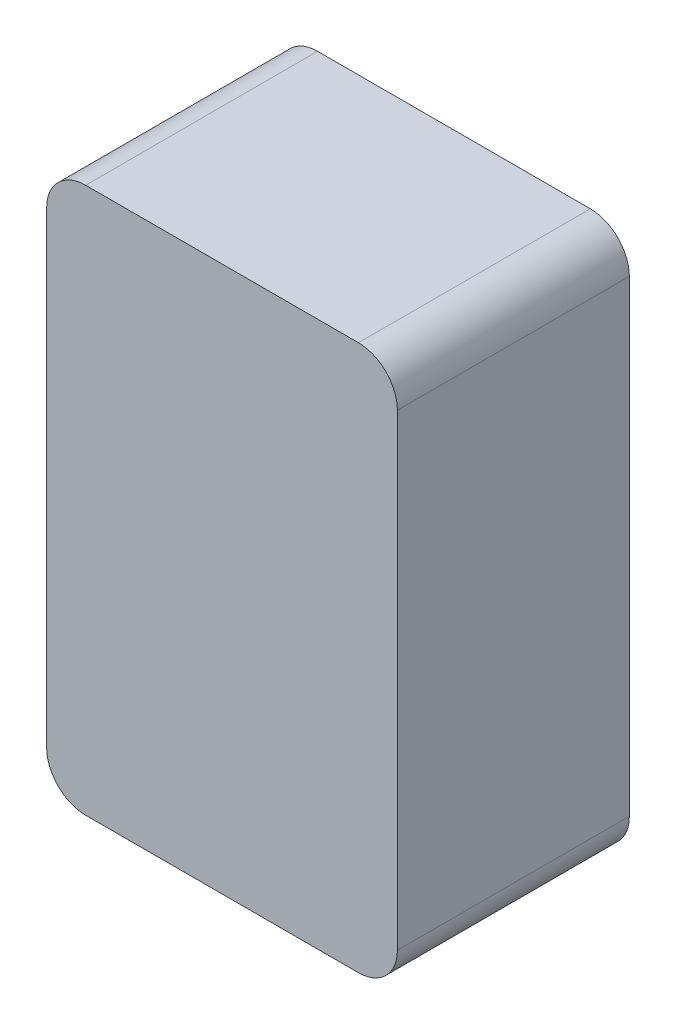
ISO-10303-21;
HEADER;
FILE_DESCRIPTION(('STEP AP214'),'2;1');
FILE_NAME('part.step','',(''),(''),'','','');
FILE_SCHEMA(('AUTOMOTIVE_DESIGN { 1 0 10303 214 1 1 1 1 }'));
ENDSEC;
DATA;
#1=APPLICATION_CONTEXT('core data for automotive mechanical design processes');
#2=APPLICATION_PROTOCOL_DEFINITION('international standard','automotive_design',2000,#1);
#3=PRODUCT_CONTEXT('',#1,'mechanical');
#4=PRODUCT('Part','Part','',(#3));
#5=PRODUCT_RELATED_PRODUCT_CATEGORY('part','',(#4));
#6=PRODUCT_DEFINITION_FORMATION('','',#4);
#7=PRODUCT_DEFINITION_CONTEXT('part definition',#1,'design');
#8=PRODUCT_DEFINITION('design','',#6,#7);
#9=PRODUCT_DEFINITION_SHAPE('','',#8);
#10=(LENGTH_UNIT() NAMED_UNIT(*) SI_UNIT(.MILLI.,.METRE.));
#11=(NAMED_UNIT(*) PLANE_ANGLE_UNIT() SI_UNIT($,.RADIAN.));
#12=(NAMED_UNIT(*) SI_UNIT($,.STERADIAN.) SOLID_ANGLE_UNIT());
#13=UNCERTAINTY_MEASURE_WITH_UNIT(LENGTH_MEASURE(1.E-05),#10,'distance_accuracy_value','');
#14=(GEOMETRIC_REPRESENTATION_CONTEXT(3) GLOBAL_UNCERTAINTY_ASSIGNED_CONTEXT((#13)) GLOBAL_UNIT_ASSIGNED_CONTEXT((#10,
#11,#12)) REPRESENTATION_CONTEXT('',''));
#15=CARTESIAN_POINT('',(0.,0.,0.));
#16=DIRECTION('',(0.,0.,1.));
#17=DIRECTION('',(1.,0.,0.));
#18=AXIS2_PLACEMENT_3D('',#15,#16,#17);
#19=CARTESIAN_POINT('',(14.2875,22.225,18.8976));
#20=DIRECTION('',(-1.,0.,0.));
#21=DIRECTION('',(0.,-1.,0.));
#22=AXIS2_PLACEMENT_3D('',#19,#20,#21);
#23=PLANE('',#22);
#24=DIRECTION('',(0.,1.,0.));
#25=VECTOR('',#24,1.);
#26=CARTESIAN_POINT('',(14.2875,22.225,18.8976));
#27=LINE('',#26,#25);
#28=CARTESIAN_POINT('',(14.2875,-19.05,18.8976));
#29=VERTEX_POINT('',#28);
#30=CARTESIAN_POINT('',(14.2875,19.05,18.8976));
#31=VERTEX_POINT('',#30);
#32=EDGE_CURVE('E138',#29,#31,#27,.T.);
#33=ORIENTED_EDGE('',*,*,#32,.F.);
#34=DIRECTION('',(0.,0.,-1.));
#35=VECTOR('',#34,1.);
#36=CARTESIAN_POINT('',(14.2875,-19.05,18.8976));
#37=LINE('',#36,#35);
#38=CARTESIAN_POINT('',(14.2875,-19.05,0.));
#39=VERTEX_POINT('',#38);
#40=EDGE_CURVE('E177',#29,#39,#37,.T.);
#41=ORIENTED_EDGE('',*,*,#40,.T.);
#42=DIRECTION('',(0.,1.,0.));
#43=VECTOR('',#42,1.);
#44=CARTESIAN_POINT('',(14.2875,22.225,0.));
#45=LINE('',#44,#43);
#46=CARTESIAN_POINT('',(14.2875,19.05,0.));
#47=VERTEX_POINT('',#46);
#48=EDGE_CURVE('E188',#39,#47,#45,.T.);
#49=ORIENTED_EDGE('',*,*,#48,.T.);
#50=DIRECTION('',(0.,0.,-1.));
#51=VECTOR('',#50,1.);
#52=CARTESIAN_POINT('',(14.2875,19.05,18.8976));
#53=LINE('',#52,#51);
#54=EDGE_CURVE('E174',#47,#31,#53,.F.);
#55=ORIENTED_EDGE('',*,*,#54,.T.);
#56=EDGE_LOOP('',(#33,#41,#49,#55));
#57=FACE_BOUND('',#56,.T.);
#58=ADVANCED_FACE('F43',(#57),#23,.F.);
#59=CARTESIAN_POINT('',(-14.2875,22.225,18.8976));
#60=DIRECTION('',(0.,-1.,0.));
#61=DIRECTION('',(0.,0.,-1.));
#62=AXIS2_PLACEMENT_3D('',#59,#60,#61);
#63=PLANE('',#62);
#64=DIRECTION('',(-1.,0.,0.));
#65=VECTOR('',#64,1.);
#66=CARTESIAN_POINT('',(-14.2875,22.225,0.));
#67=LINE('',#66,#65);
#68=CARTESIAN_POINT('',(11.1125,22.225,0.));
#69=VERTEX_POINT('',#68);
#70=CARTESIAN_POINT('',(-11.1125,22.225,0.));
#71=VERTEX_POINT('',#70);
#72=EDGE_CURVE('E145',#69,#71,#67,.T.);
#73=ORIENTED_EDGE('',*,*,#72,.T.);
#74=DIRECTION('',(0.,0.,-1.));
#75=VECTOR('',#74,1.);
#76=CARTESIAN_POINT('',(-11.1125,22.225,18.8976));
#77=LINE('',#76,#75);
#78=CARTESIAN_POINT('',(-11.1125,22.225,18.8976));
#79=VERTEX_POINT('',#78);
#80=EDGE_CURVE('E11',#71,#79,#77,.F.);
#81=ORIENTED_EDGE('',*,*,#80,.T.);
#82=DIRECTION('',(-1.,0.,0.));
#83=VECTOR('',#82,1.);
#84=CARTESIAN_POINT('',(-14.2875,22.225,18.8976));
#85=LINE('',#84,#83);
#86=CARTESIAN_POINT('',(11.1125,22.225,18.8976));
#87=VERTEX_POINT('',#86);
#88=EDGE_CURVE('E143',#87,#79,#85,.T.);
#89=ORIENTED_EDGE('',*,*,#88,.F.);
#90=DIRECTION('',(0.,0.,-1.));
#91=VECTOR('',#90,1.);
#92=CARTESIAN_POINT('',(11.1125,22.225,18.8976));
#93=LINE('',#92,#91);
#94=EDGE_CURVE('E52',#87,#69,#93,.T.);
#95=ORIENTED_EDGE('',*,*,#94,.T.);
#96=EDGE_LOOP('',(#73,#81,#89,#95));
#97=FACE_BOUND('',#96,.T.);
#98=ADVANCED_FACE('F184',(#97),#63,.F.);
#99=CARTESIAN_POINT('',(-14.2875,22.225,18.8976));
#100=DIRECTION('',(1.,0.,0.));
#101=DIRECTION('',(0.,1.,0.));
#102=AXIS2_PLACEMENT_3D('',#99,#100,#101);
#103=PLANE('',#102);
#104=DIRECTION('',(0.,-1.,0.));
#105=VECTOR('',#104,1.);
#106=CARTESIAN_POINT('',(-14.2875,22.225,0.));
#107=LINE('',#106,#105);
#108=CARTESIAN_POINT('',(-14.2875,19.05,0.));
#109=VERTEX_POINT('',#108);
#110=CARTESIAN_POINT('',(-14.2875,-19.05,0.));
#111=VERTEX_POINT('',#110);
#112=EDGE_CURVE('E139',#109,#111,#107,.T.);
#113=ORIENTED_EDGE('',*,*,#112,.T.);
#114=DIRECTION('',(0.,0.,-1.));
#115=VECTOR('',#114,1.);
#116=CARTESIAN_POINT('',(-14.2875,-19.05,18.8976));
#117=LINE('',#116,#115);
#118=CARTESIAN_POINT('',(-14.2875,-19.05,18.8976));
#119=VERTEX_POINT('',#118);
#120=EDGE_CURVE('E114',#111,#119,#117,.F.);
#121=ORIENTED_EDGE('',*,*,#120,.T.);
#122=DIRECTION('',(0.,-1.,0.));
#123=VECTOR('',#122,1.);
#124=CARTESIAN_POINT('',(-14.2875,22.225,18.8976));
#125=LINE('',#124,#123);
#126=CARTESIAN_POINT('',(-14.2875,19.05,18.8976));
#127=VERTEX_POINT('',#126);
#128=EDGE_CURVE('E194',#127,#119,#125,.T.);
#129=ORIENTED_EDGE('',*,*,#128,.F.);
#130=DIRECTION('',(0.,0.,-1.));
#131=VECTOR('',#130,1.);
#132=CARTESIAN_POINT('',(-14.2875,19.05,18.8976));
#133=LINE('',#132,#131);
#134=EDGE_CURVE('E120',#127,#109,#133,.T.);
#135=ORIENTED_EDGE('',*,*,#134,.T.);
#136=EDGE_LOOP('',(#113,#121,#129,#135));
#137=FACE_BOUND('',#136,.T.);
#138=ADVANCED_FACE('F206',(#137),#103,.F.);
#139=CARTESIAN_POINT('',(-14.2875,-22.225,18.8976));
#140=DIRECTION('',(0.,1.,0.));
#141=DIRECTION('',(0.,0.,1.));
#142=AXIS2_PLACEMENT_3D('',#139,#140,#141);
#143=PLANE('',#142);
#144=DIRECTION('',(1.,0.,0.));
#145=VECTOR('',#144,1.);
#146=CARTESIAN_POINT('',(-14.2875,-22.225,18.8976));
#147=LINE('',#146,#145);
#148=CARTESIAN_POINT('',(-11.1125,-22.225,18.8976));
#149=VERTEX_POINT('',#148);
#150=CARTESIAN_POINT('',(11.1125,-22.225,18.8976));
#151=VERTEX_POINT('',#150);
#152=EDGE_CURVE('E130',#149,#151,#147,.T.);
#153=ORIENTED_EDGE('',*,*,#152,.F.);
#154=DIRECTION('',(0.,0.,-1.));
#155=VECTOR('',#154,1.);
#156=CARTESIAN_POINT('',(-11.1125,-22.225,18.8976));
#157=LINE('',#156,#155);
#158=CARTESIAN_POINT('',(-11.1125,-22.225,0.));
#159=VERTEX_POINT('',#158);
#160=EDGE_CURVE('E113',#149,#159,#157,.T.);
#161=ORIENTED_EDGE('',*,*,#160,.T.);
#162=DIRECTION('',(1.,0.,0.));
#163=VECTOR('',#162,1.);
#164=CARTESIAN_POINT('',(-14.2875,-22.225,0.));
#165=LINE('',#164,#163);
#166=CARTESIAN_POINT('',(11.1125,-22.225,0.));
#167=VERTEX_POINT('',#166);
#168=EDGE_CURVE('E127',#159,#167,#165,.T.);
#169=ORIENTED_EDGE('',*,*,#168,.T.);
#170=DIRECTION('',(0.,0.,-1.));
#171=VECTOR('',#170,1.);
#172=CARTESIAN_POINT('',(11.1125,-22.225,18.8976));
#173=LINE('',#172,#171);
#174=EDGE_CURVE('E133',#167,#151,#173,.F.);
#175=ORIENTED_EDGE('',*,*,#174,.T.);
#176=EDGE_LOOP('',(#153,#161,#169,#175));
#177=FACE_BOUND('',#176,.T.);
#178=ADVANCED_FACE('F126',(#177),#143,.F.);
#179=CARTESIAN_POINT('',(0.,0.,18.8976));
#180=DIRECTION('',(0.,0.,1.));
#181=DIRECTION('',(1.,0.,0.));
#182=AXIS2_PLACEMENT_3D('',#179,#180,#181);
#183=PLANE('',#182);
#184=ORIENTED_EDGE('',*,*,#128,.T.);
#185=CARTESIAN_POINT('',(-11.1125,-19.05,18.8976));
#186=DIRECTION('',(0.,0.,1.));
#187=DIRECTION('',(1.,0.,0.));
#188=AXIS2_PLACEMENT_3D('',#185,#186,#187);
#189=CIRCLE('',#188,3.175);
#190=EDGE_CURVE('E171',#119,#149,#189,.T.);
#191=ORIENTED_EDGE('',*,*,#190,.T.);
#192=ORIENTED_EDGE('',*,*,#152,.T.);
#193=CARTESIAN_POINT('',(11.1125,-19.05,18.8976));
#194=DIRECTION('',(0.,0.,1.));
#195=DIRECTION('',(1.,0.,0.));
#196=AXIS2_PLACEMENT_3D('',#193,#194,#195);
#197=CIRCLE('',#196,3.175);
#198=EDGE_CURVE('E168',#151,#29,#197,.T.);
#199=ORIENTED_EDGE('',*,*,#198,.T.);
#200=ORIENTED_EDGE('',*,*,#32,.T.);
#201=CARTESIAN_POINT('',(11.1125,19.05,18.8976));
#202=DIRECTION('',(0.,0.,1.));
#203=DIRECTION('',(1.,0.,0.));
#204=AXIS2_PLACEMENT_3D('',#201,#202,#203);
#205=CIRCLE('',#204,3.175);
#206=EDGE_CURVE('E64',#31,#87,#205,.T.);
#207=ORIENTED_EDGE('',*,*,#206,.T.);
#208=ORIENTED_EDGE('',*,*,#88,.T.);
#209=CARTESIAN_POINT('',(-11.1125,19.05,18.8976));
#210=DIRECTION('',(0.,0.,1.));
#211=DIRECTION('',(1.,0.,0.));
#212=AXIS2_PLACEMENT_3D('',#209,#210,#211);
#213=CIRCLE('',#212,3.175);
#214=EDGE_CURVE('E165',#79,#127,#213,.T.);
#215=ORIENTED_EDGE('',*,*,#214,.T.);
#216=EDGE_LOOP('',(#184,#191,#192,#199,#200,#207,#208,#215));
#217=FACE_BOUND('',#216,.T.);
#218=ADVANCED_FACE('F200',(#217),#183,.T.);
#219=CARTESIAN_POINT('',(0.,0.,0.));
#220=DIRECTION('',(0.,0.,1.));
#221=DIRECTION('',(1.,0.,0.));
#222=AXIS2_PLACEMENT_3D('',#219,#220,#221);
#223=PLANE('',#222);
#224=ORIENTED_EDGE('',*,*,#168,.F.);
#225=CARTESIAN_POINT('',(-11.1125,-19.05,0.));
#226=DIRECTION('',(0.,0.,1.));
#227=DIRECTION('',(1.,0.,0.));
#228=AXIS2_PLACEMENT_3D('',#225,#226,#227);
#229=CIRCLE('',#228,3.175);
#230=EDGE_CURVE('E109',#159,#111,#229,.F.);
#231=ORIENTED_EDGE('',*,*,#230,.T.);
#232=ORIENTED_EDGE('',*,*,#112,.F.);
#233=CARTESIAN_POINT('',(-11.1125,19.05,0.));
#234=DIRECTION('',(0.,0.,1.));
#235=DIRECTION('',(1.,0.,0.));
#236=AXIS2_PLACEMENT_3D('',#233,#234,#235);
#237=CIRCLE('',#236,3.175);
#238=EDGE_CURVE('E153',#109,#71,#237,.F.);
#239=ORIENTED_EDGE('',*,*,#238,.T.);
#240=ORIENTED_EDGE('',*,*,#72,.F.);
#241=CARTESIAN_POINT('',(11.1125,19.05,0.));
#242=DIRECTION('',(0.,0.,1.));
#243=DIRECTION('',(1.,0.,0.));
#244=AXIS2_PLACEMENT_3D('',#241,#242,#243);
#245=CIRCLE('',#244,3.175);
#246=EDGE_CURVE('E132',#69,#47,#245,.F.);
#247=ORIENTED_EDGE('',*,*,#246,.T.);
#248=ORIENTED_EDGE('',*,*,#48,.F.);
#249=CARTESIAN_POINT('',(11.1125,-19.05,0.));
#250=DIRECTION('',(0.,0.,1.));
#251=DIRECTION('',(1.,0.,0.));
#252=AXIS2_PLACEMENT_3D('',#249,#250,#251);
#253=CIRCLE('',#252,3.175);
#254=EDGE_CURVE('E121',#39,#167,#253,.F.);
#255=ORIENTED_EDGE('',*,*,#254,.T.);
#256=EDGE_LOOP('',(#224,#231,#232,#239,#240,#247,#248,#255));
#257=FACE_BOUND('',#256,.T.);
#258=ADVANCED_FACE('F135',(#257),#223,.F.);
#259=CARTESIAN_POINT('',(-11.1125,-19.05,18.8976));
#260=DIRECTION('',(0.,0.,-1.));
#261=DIRECTION('',(-1.,0.,0.));
#262=AXIS2_PLACEMENT_3D('',#259,#260,#261);
#263=CYLINDRICAL_SURFACE('',#262,3.175);
#264=ORIENTED_EDGE('',*,*,#190,.F.);
#265=ORIENTED_EDGE('',*,*,#120,.F.);
#266=ORIENTED_EDGE('',*,*,#230,.F.);
#267=ORIENTED_EDGE('',*,*,#160,.F.);
#268=EDGE_LOOP('',(#264,#265,#266,#267));
#269=FACE_BOUND('',#268,.T.);
#270=ADVANCED_FACE('F112',(#269),#263,.T.);
#271=CARTESIAN_POINT('',(11.1125,-19.05,18.8976));
#272=DIRECTION('',(0.,0.,-1.));
#273=DIRECTION('',(-1.,0.,0.));
#274=AXIS2_PLACEMENT_3D('',#271,#272,#273);
#275=CYLINDRICAL_SURFACE('',#274,3.175);
#276=ORIENTED_EDGE('',*,*,#198,.F.);
#277=ORIENTED_EDGE('',*,*,#174,.F.);
#278=ORIENTED_EDGE('',*,*,#254,.F.);
#279=ORIENTED_EDGE('',*,*,#40,.F.);
#280=EDGE_LOOP('',(#276,#277,#278,#279));
#281=FACE_BOUND('',#280,.T.);
#282=ADVANCED_FACE('F211',(#281),#275,.T.);
#283=CARTESIAN_POINT('',(-11.1125,19.05,18.8976));
#284=DIRECTION('',(0.,0.,-1.));
#285=DIRECTION('',(-1.,0.,0.));
#286=AXIS2_PLACEMENT_3D('',#283,#284,#285);
#287=CYLINDRICAL_SURFACE('',#286,3.175);
#288=ORIENTED_EDGE('',*,*,#214,.F.);
#289=ORIENTED_EDGE('',*,*,#80,.F.);
#290=ORIENTED_EDGE('',*,*,#238,.F.);
#291=ORIENTED_EDGE('',*,*,#134,.F.);
#292=EDGE_LOOP('',(#288,#289,#290,#291));
#293=FACE_BOUND('',#292,.T.);
#294=ADVANCED_FACE('F204',(#293),#287,.T.);
#295=CARTESIAN_POINT('',(11.1125,19.05,18.8976));
#296=DIRECTION('',(0.,0.,-1.));
#297=DIRECTION('',(-1.,0.,0.));
#298=AXIS2_PLACEMENT_3D('',#295,#296,#297);
#299=CYLINDRICAL_SURFACE('',#298,3.175);
#300=ORIENTED_EDGE('',*,*,#206,.F.);
#301=ORIENTED_EDGE('',*,*,#54,.F.);
#302=ORIENTED_EDGE('',*,*,#246,.F.);
#303=ORIENTED_EDGE('',*,*,#94,.F.);
#304=EDGE_LOOP('',(#300,#301,#302,#303));
#305=FACE_BOUND('',#304,.T.);
#306=ADVANCED_FACE('F45',(#305),#299,.T.);
#307=CLOSED_SHELL('',(#58,#98,#138,#178,#218,#258,#270,#282,#294,#306));
#308=MANIFOLD_SOLID_BREP('B2',#307);
#309=ADVANCED_BREP_SHAPE_REPRESENTATION('',(#18,#308),#14);
#310=SHAPE_DEFINITION_REPRESENTATION(#9,#309);
ENDSEC;
END-ISO-10303-21;
